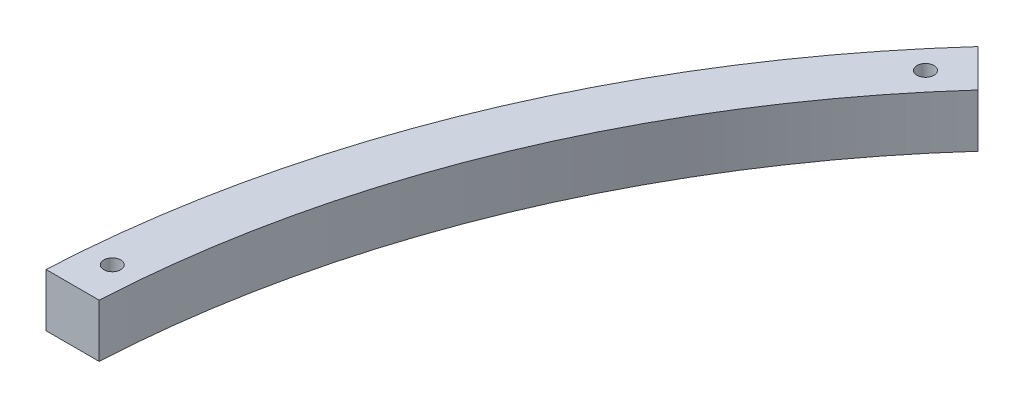
ISO-10303-21;
HEADER;
FILE_DESCRIPTION(('STEP AP214'),'2;1');
FILE_NAME('part.step','',(''),(''),'','','');
FILE_SCHEMA(('AUTOMOTIVE_DESIGN { 1 0 10303 214 1 1 1 1 }'));
ENDSEC;
DATA;
#1=APPLICATION_CONTEXT('core data for automotive mechanical design processes');
#2=APPLICATION_PROTOCOL_DEFINITION('international standard','automotive_design',2000,#1);
#3=PRODUCT_CONTEXT('',#1,'mechanical');
#4=PRODUCT('Part','Part','',(#3));
#5=PRODUCT_RELATED_PRODUCT_CATEGORY('part','',(#4));
#6=PRODUCT_DEFINITION_FORMATION('','',#4);
#7=PRODUCT_DEFINITION_CONTEXT('part definition',#1,'design');
#8=PRODUCT_DEFINITION('design','',#6,#7);
#9=PRODUCT_DEFINITION_SHAPE('','',#8);
#10=(LENGTH_UNIT() NAMED_UNIT(*) SI_UNIT(.MILLI.,.METRE.));
#11=(NAMED_UNIT(*) PLANE_ANGLE_UNIT() SI_UNIT($,.RADIAN.));
#12=(NAMED_UNIT(*) SI_UNIT($,.STERADIAN.) SOLID_ANGLE_UNIT());
#13=UNCERTAINTY_MEASURE_WITH_UNIT(LENGTH_MEASURE(1.E-05),#10,'distance_accuracy_value','');
#14=(GEOMETRIC_REPRESENTATION_CONTEXT(3) GLOBAL_UNCERTAINTY_ASSIGNED_CONTEXT((#13)) GLOBAL_UNIT_ASSIGNED_CONTEXT((#10,
#11,#12)) REPRESENTATION_CONTEXT('',''));
#15=CARTESIAN_POINT('',(0.,0.,0.));
#16=DIRECTION('',(0.,0.,1.));
#17=DIRECTION('',(1.,0.,0.));
#18=AXIS2_PLACEMENT_3D('',#15,#16,#17);
#19=CARTESIAN_POINT('',(0.,5.,0.));
#20=DIRECTION('',(0.,-1.,0.));
#21=DIRECTION('',(0.,0.,-1.));
#22=AXIS2_PLACEMENT_3D('',#19,#20,#21);
#23=CYLINDRICAL_SURFACE('',#22,190.);
#24=CARTESIAN_POINT('',(0.,-5.,0.));
#25=DIRECTION('',(0.,1.,0.));
#26=DIRECTION('',(0.,0.,1.));
#27=AXIS2_PLACEMENT_3D('',#24,#25,#26);
#28=CIRCLE('',#27,190.);
#29=CARTESIAN_POINT('',(-141.235146461853,-5.,-127.093010838122));
#30=VERTEX_POINT('',#29);
#31=CARTESIAN_POINT('',(-189.736659610103,-5.,-10.));
#32=VERTEX_POINT('',#31);
#33=EDGE_CURVE('E100',#30,#32,#28,.T.);
#34=ORIENTED_EDGE('',*,*,#33,.F.);
#35=DIRECTION('',(0.,-1.,0.));
#36=VECTOR('',#35,1.);
#37=CARTESIAN_POINT('',(-141.235146461853,5.,-127.093010838122));
#38=LINE('',#37,#36);
#39=CARTESIAN_POINT('',(-141.235146461853,5.,-127.093010838122));
#40=VERTEX_POINT('',#39);
#41=EDGE_CURVE('E11',#40,#30,#38,.T.);
#42=ORIENTED_EDGE('',*,*,#41,.F.);
#43=CARTESIAN_POINT('',(0.,5.,0.));
#44=DIRECTION('',(0.,1.,0.));
#45=DIRECTION('',(0.,0.,1.));
#46=AXIS2_PLACEMENT_3D('',#43,#44,#45);
#47=CIRCLE('',#46,190.);
#48=CARTESIAN_POINT('',(-189.736659610103,5.,-10.));
#49=VERTEX_POINT('',#48);
#50=EDGE_CURVE('E93',#40,#49,#47,.T.);
#51=ORIENTED_EDGE('',*,*,#50,.T.);
#52=DIRECTION('',(0.,-1.,0.));
#53=VECTOR('',#52,1.);
#54=CARTESIAN_POINT('',(-189.736659610103,5.,-10.));
#55=LINE('',#54,#53);
#56=EDGE_CURVE('E74',#49,#32,#55,.T.);
#57=ORIENTED_EDGE('',*,*,#56,.T.);
#58=EDGE_LOOP('',(#34,#42,#51,#57));
#59=FACE_BOUND('',#58,.T.);
#60=ADVANCED_FACE('F36',(#59),#23,.F.);
#61=CARTESIAN_POINT('',(-7.07106781186545,5.,7.07106781186545));
#62=DIRECTION('',(0.707106781186548,0.,-0.707106781186548));
#63=DIRECTION('',(-0.707106781186548,0.,-0.707106781186548));
#64=AXIS2_PLACEMENT_3D('',#61,#62,#63);
#65=PLANE('',#64);
#66=DIRECTION('',(0.707106781186548,0.,0.707106781186548));
#67=VECTOR('',#66,1.);
#68=CARTESIAN_POINT('',(-7.07106781186545,-5.,7.07106781186545));
#69=LINE('',#68,#67);
#70=CARTESIAN_POINT('',(-148.315536730121,-5.,-134.17340110639));
#71=VERTEX_POINT('',#70);
#72=EDGE_CURVE('E87',#71,#30,#69,.T.);
#73=ORIENTED_EDGE('',*,*,#72,.F.);
#74=DIRECTION('',(0.,-1.,0.));
#75=VECTOR('',#74,1.);
#76=CARTESIAN_POINT('',(-148.315536730121,5.,-134.17340110639));
#77=LINE('',#76,#75);
#78=CARTESIAN_POINT('',(-148.315536730121,5.,-134.17340110639));
#79=VERTEX_POINT('',#78);
#80=EDGE_CURVE('E44',#79,#71,#77,.T.);
#81=ORIENTED_EDGE('',*,*,#80,.F.);
#82=DIRECTION('',(0.707106781186548,0.,0.707106781186548));
#83=VECTOR('',#82,1.);
#84=CARTESIAN_POINT('',(-7.07106781186545,5.,7.07106781186545));
#85=LINE('',#84,#83);
#86=EDGE_CURVE('E85',#79,#40,#85,.T.);
#87=ORIENTED_EDGE('',*,*,#86,.T.);
#88=ORIENTED_EDGE('',*,*,#41,.T.);
#89=EDGE_LOOP('',(#73,#81,#87,#88));
#90=FACE_BOUND('',#89,.T.);
#91=ADVANCED_FACE('F83',(#90),#65,.T.);
#92=CARTESIAN_POINT('',(0.,5.,0.));
#93=DIRECTION('',(0.,-1.,0.));
#94=DIRECTION('',(0.,0.,-1.));
#95=AXIS2_PLACEMENT_3D('',#92,#93,#94);
#96=CYLINDRICAL_SURFACE('',#95,200.);
#97=CARTESIAN_POINT('',(0.,-5.,0.));
#98=DIRECTION('',(0.,1.,0.));
#99=DIRECTION('',(0.,0.,1.));
#100=AXIS2_PLACEMENT_3D('',#97,#98,#99);
#101=CIRCLE('',#100,200.);
#102=CARTESIAN_POINT('',(-199.749843554382,-5.,-10.));
#103=VERTEX_POINT('',#102);
#104=EDGE_CURVE('E67',#71,#103,#101,.T.);
#105=ORIENTED_EDGE('',*,*,#104,.T.);
#106=DIRECTION('',(0.,-1.,0.));
#107=VECTOR('',#106,1.);
#108=CARTESIAN_POINT('',(-199.749843554382,5.,-10.));
#109=LINE('',#108,#107);
#110=CARTESIAN_POINT('',(-199.749843554382,5.,-10.));
#111=VERTEX_POINT('',#110);
#112=EDGE_CURVE('E88',#111,#103,#109,.T.);
#113=ORIENTED_EDGE('',*,*,#112,.F.);
#114=CARTESIAN_POINT('',(0.,5.,0.));
#115=DIRECTION('',(0.,1.,0.));
#116=DIRECTION('',(0.,0.,1.));
#117=AXIS2_PLACEMENT_3D('',#114,#115,#116);
#118=CIRCLE('',#117,200.);
#119=EDGE_CURVE('E89',#79,#111,#118,.T.);
#120=ORIENTED_EDGE('',*,*,#119,.F.);
#121=ORIENTED_EDGE('',*,*,#80,.T.);
#122=EDGE_LOOP('',(#105,#113,#120,#121));
#123=FACE_BOUND('',#122,.T.);
#124=ADVANCED_FACE('F90',(#123),#96,.T.);
#125=CARTESIAN_POINT('',(0.,5.,-10.));
#126=DIRECTION('',(0.,0.,-1.));
#127=DIRECTION('',(-1.,0.,0.));
#128=AXIS2_PLACEMENT_3D('',#125,#126,#127);
#129=PLANE('',#128);
#130=DIRECTION('',(1.,0.,0.));
#131=VECTOR('',#130,1.);
#132=CARTESIAN_POINT('',(0.,-5.,-10.));
#133=LINE('',#132,#131);
#134=EDGE_CURVE('E95',#103,#32,#133,.T.);
#135=ORIENTED_EDGE('',*,*,#134,.T.);
#136=ORIENTED_EDGE('',*,*,#56,.F.);
#137=DIRECTION('',(1.,0.,0.));
#138=VECTOR('',#137,1.);
#139=CARTESIAN_POINT('',(0.,5.,-10.));
#140=LINE('',#139,#138);
#141=EDGE_CURVE('E52',#111,#49,#140,.T.);
#142=ORIENTED_EDGE('',*,*,#141,.F.);
#143=ORIENTED_EDGE('',*,*,#112,.T.);
#144=EDGE_LOOP('',(#135,#136,#142,#143));
#145=FACE_BOUND('',#144,.T.);
#146=ADVANCED_FACE('F110',(#145),#129,.F.);
#147=CARTESIAN_POINT('',(0.,5.,0.));
#148=DIRECTION('',(0.,1.,0.));
#149=DIRECTION('',(0.,0.,1.));
#150=AXIS2_PLACEMENT_3D('',#147,#148,#149);
#151=PLANE('',#150);
#152=CARTESIAN_POINT('',(-194.25796612789,5.,-16.995369835792));
#153=DIRECTION('',(0.,1.,0.));
#154=DIRECTION('',(0.,0.,1.));
#155=AXIS2_PLACEMENT_3D('',#152,#153,#154);
#156=CIRCLE('',#155,1.59999999999999);
#157=CARTESIAN_POINT('',(-194.25796612789,5.,-15.395369835792));
#158=VERTEX_POINT('',#157);
#159=EDGE_CURVE('E145',#158,#158,#156,.T.);
#160=ORIENTED_EDGE('',*,*,#159,.F.);
#161=EDGE_LOOP('',(#160));
#162=FACE_BOUND('',#161,.T.);
#163=CARTESIAN_POINT('',(-149.3786664082,5.,-125.343583888876));
#164=DIRECTION('',(0.,1.,0.));
#165=DIRECTION('',(0.,0.,1.));
#166=AXIS2_PLACEMENT_3D('',#163,#164,#165);
#167=CIRCLE('',#166,1.59999999999999);
#168=CARTESIAN_POINT('',(-149.3786664082,5.,-123.743583888876));
#169=VERTEX_POINT('',#168);
#170=EDGE_CURVE('E147',#169,#169,#167,.T.);
#171=ORIENTED_EDGE('',*,*,#170,.F.);
#172=EDGE_LOOP('',(#171));
#173=FACE_BOUND('',#172,.T.);
#174=ORIENTED_EDGE('',*,*,#50,.F.);
#175=ORIENTED_EDGE('',*,*,#86,.F.);
#176=ORIENTED_EDGE('',*,*,#119,.T.);
#177=ORIENTED_EDGE('',*,*,#141,.T.);
#178=EDGE_LOOP('',(#174,#175,#176,#177));
#179=FACE_BOUND('',#178,.T.);
#180=ADVANCED_FACE('F92',(#162,#173,#179),#151,.T.);
#181=CARTESIAN_POINT('',(0.,-5.,0.));
#182=DIRECTION('',(0.,1.,0.));
#183=DIRECTION('',(0.,0.,1.));
#184=AXIS2_PLACEMENT_3D('',#181,#182,#183);
#185=PLANE('',#184);
#186=CARTESIAN_POINT('',(-194.25796612789,-5.,-16.995369835792));
#187=DIRECTION('',(0.,1.,0.));
#188=DIRECTION('',(0.,0.,1.));
#189=AXIS2_PLACEMENT_3D('',#186,#187,#188);
#190=CIRCLE('',#189,1.59999999999999);
#191=CARTESIAN_POINT('',(-194.25796612789,-5.,-15.395369835792));
#192=VERTEX_POINT('',#191);
#193=EDGE_CURVE('E142',#192,#192,#190,.T.);
#194=ORIENTED_EDGE('',*,*,#193,.T.);
#195=EDGE_LOOP('',(#194));
#196=FACE_BOUND('',#195,.T.);
#197=CARTESIAN_POINT('',(-149.3786664082,-5.,-125.343583888876));
#198=DIRECTION('',(0.,1.,0.));
#199=DIRECTION('',(0.,0.,1.));
#200=AXIS2_PLACEMENT_3D('',#197,#198,#199);
#201=CIRCLE('',#200,1.59999999999999);
#202=CARTESIAN_POINT('',(-149.3786664082,-5.,-123.743583888876));
#203=VERTEX_POINT('',#202);
#204=EDGE_CURVE('E103',#203,#203,#201,.T.);
#205=ORIENTED_EDGE('',*,*,#204,.T.);
#206=EDGE_LOOP('',(#205));
#207=FACE_BOUND('',#206,.T.);
#208=ORIENTED_EDGE('',*,*,#33,.T.);
#209=ORIENTED_EDGE('',*,*,#134,.F.);
#210=ORIENTED_EDGE('',*,*,#104,.F.);
#211=ORIENTED_EDGE('',*,*,#72,.T.);
#212=EDGE_LOOP('',(#208,#209,#210,#211));
#213=FACE_BOUND('',#212,.T.);
#214=ADVANCED_FACE('F112',(#196,#207,#213),#185,.F.);
#215=CARTESIAN_POINT('',(-149.3786664082,5.,-125.343583888876));
#216=DIRECTION('',(0.,1.,0.));
#217=DIRECTION('',(0.,0.,1.));
#218=AXIS2_PLACEMENT_3D('',#215,#216,#217);
#219=CYLINDRICAL_SURFACE('',#218,1.59999999999999);
#220=ORIENTED_EDGE('',*,*,#204,.F.);
#221=EDGE_LOOP('',(#220));
#222=FACE_BOUND('',#221,.T.);
#223=ORIENTED_EDGE('',*,*,#170,.T.);
#224=EDGE_LOOP('',(#223));
#225=FACE_BOUND('',#224,.T.);
#226=ADVANCED_FACE('F126',(#222,#225),#219,.F.);
#227=CARTESIAN_POINT('',(-194.25796612789,5.,-16.995369835792));
#228=DIRECTION('',(0.,1.,0.));
#229=DIRECTION('',(0.,0.,1.));
#230=AXIS2_PLACEMENT_3D('',#227,#228,#229);
#231=CYLINDRICAL_SURFACE('',#230,1.59999999999999);
#232=ORIENTED_EDGE('',*,*,#193,.F.);
#233=EDGE_LOOP('',(#232));
#234=FACE_BOUND('',#233,.T.);
#235=ORIENTED_EDGE('',*,*,#159,.T.);
#236=EDGE_LOOP('',(#235));
#237=FACE_BOUND('',#236,.T.);
#238=ADVANCED_FACE('F133',(#234,#237),#231,.F.);
#239=CLOSED_SHELL('',(#60,#91,#124,#146,#180,#214,#226,#238));
#240=MANIFOLD_SOLID_BREP('B2',#239);
#241=ADVANCED_BREP_SHAPE_REPRESENTATION('',(#18,#240),#14);
#242=SHAPE_DEFINITION_REPRESENTATION(#9,#241);
ENDSEC;
END-ISO-10303-21;
